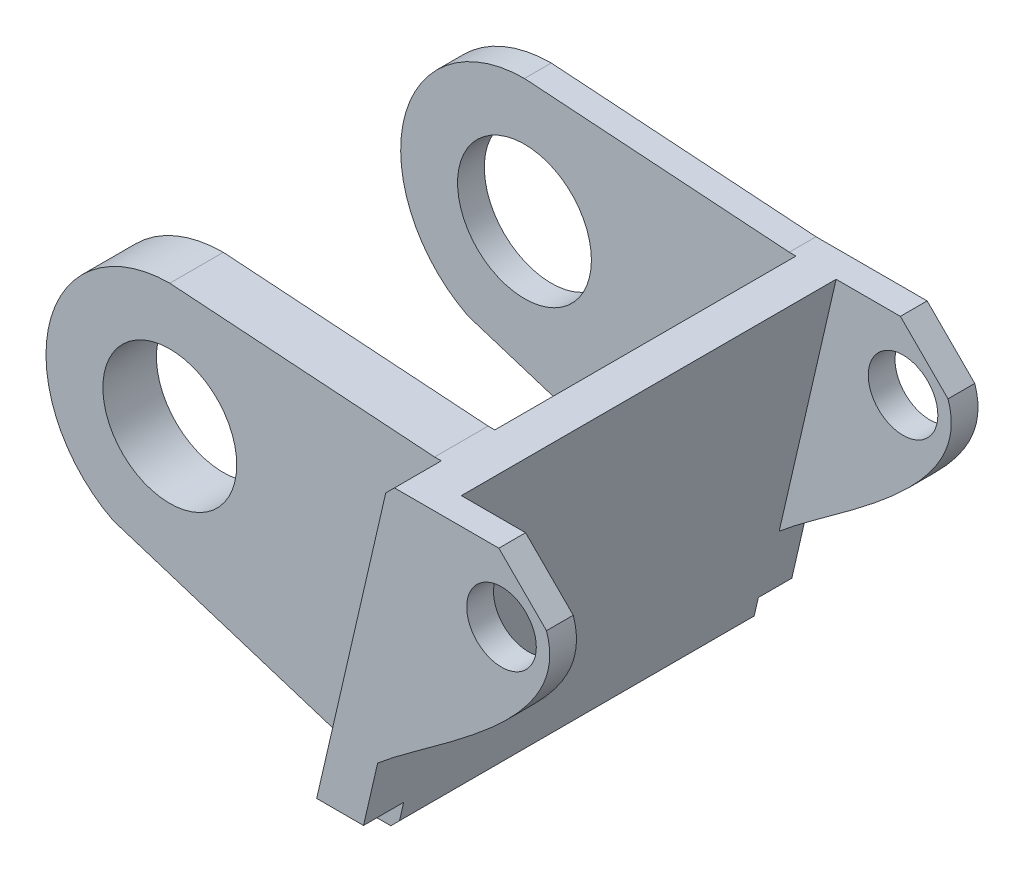
ISO-10303-21;
HEADER;
FILE_DESCRIPTION(('STEP AP214'),'2;1');
FILE_NAME('part.step','',(''),(''),'','','');
FILE_SCHEMA(('AUTOMOTIVE_DESIGN { 1 0 10303 214 1 1 1 1 }'));
ENDSEC;
DATA;
#1=APPLICATION_CONTEXT('core data for automotive mechanical design processes');
#2=APPLICATION_PROTOCOL_DEFINITION('international standard','automotive_design',2000,#1);
#3=PRODUCT_CONTEXT('',#1,'mechanical');
#4=PRODUCT('Part','Part','',(#3));
#5=PRODUCT_RELATED_PRODUCT_CATEGORY('part','',(#4));
#6=PRODUCT_DEFINITION_FORMATION('','',#4);
#7=PRODUCT_DEFINITION_CONTEXT('part definition',#1,'design');
#8=PRODUCT_DEFINITION('design','',#6,#7);
#9=PRODUCT_DEFINITION_SHAPE('','',#8);
#10=(LENGTH_UNIT() NAMED_UNIT(*) SI_UNIT(.MILLI.,.METRE.));
#11=(NAMED_UNIT(*) PLANE_ANGLE_UNIT() SI_UNIT($,.RADIAN.));
#12=(NAMED_UNIT(*) SI_UNIT($,.STERADIAN.) SOLID_ANGLE_UNIT());
#13=UNCERTAINTY_MEASURE_WITH_UNIT(LENGTH_MEASURE(1.E-05),#10,'distance_accuracy_value','');
#14=(GEOMETRIC_REPRESENTATION_CONTEXT(3) GLOBAL_UNCERTAINTY_ASSIGNED_CONTEXT((#13)) GLOBAL_UNIT_ASSIGNED_CONTEXT((#10,
#11,#12)) REPRESENTATION_CONTEXT('',''));
#15=CARTESIAN_POINT('',(0.,0.,0.));
#16=DIRECTION('',(0.,0.,1.));
#17=DIRECTION('',(1.,0.,0.));
#18=AXIS2_PLACEMENT_3D('',#15,#16,#17);
#19=CARTESIAN_POINT('',(10.1099099822132,160.217391304348,320.));
#20=DIRECTION('',(0.974370064785234,-0.224951054343869,0.));
#21=DIRECTION('',(0.224951054343869,0.974370064785234,0.));
#22=AXIS2_PLACEMENT_3D('',#19,#20,#21);
#23=PLANE('',#22);
#24=DIRECTION('',(-0.224951054343869,-0.974370064785234,0.));
#25=VECTOR('',#24,1.);
#26=CARTESIAN_POINT('',(-47.6071377991786,-89.7826086956521,25.));
#27=LINE('',#26,#25);
#28=CARTESIAN_POINT('',(-42.9897739766673,-69.7826086956521,25.));
#29=VERTEX_POINT('',#28);
#30=CARTESIAN_POINT('',(-46.4823825274593,-84.9107583717259,25.));
#31=VERTEX_POINT('',#30);
#32=EDGE_CURVE('E571',#29,#31,#27,.T.);
#33=ORIENTED_EDGE('',*,*,#32,.T.);
#34=DIRECTION('',(0.,0.,1.));
#35=VECTOR('',#34,1.);
#36=CARTESIAN_POINT('',(-46.4823825274593,-84.9107583717258,320.));
#37=LINE('',#36,#35);
#38=CARTESIAN_POINT('',(-46.4823825274593,-84.9107583717259,290.));
#39=VERTEX_POINT('',#38);
#40=EDGE_CURVE('E449',#31,#39,#37,.T.);
#41=ORIENTED_EDGE('',*,*,#40,.T.);
#42=DIRECTION('',(-0.224951054343869,-0.974370064785234,0.));
#43=VECTOR('',#42,1.);
#44=CARTESIAN_POINT('',(-47.6071377991786,-89.7826086956521,290.));
#45=LINE('',#44,#43);
#46=CARTESIAN_POINT('',(-42.9897739766673,-69.7826086956521,290.));
#47=VERTEX_POINT('',#46);
#48=EDGE_CURVE('E540',#47,#39,#45,.T.);
#49=ORIENTED_EDGE('',*,*,#48,.F.);
#50=DIRECTION('',(0.,0.,1.));
#51=VECTOR('',#50,1.);
#52=CARTESIAN_POINT('',(-42.9897739766673,-69.7826086956521,290.));
#53=LINE('',#52,#51);
#54=CARTESIAN_POINT('',(-42.9897739766673,-69.7826086956521,320.));
#55=VERTEX_POINT('',#54);
#56=EDGE_CURVE('E528',#47,#55,#53,.T.);
#57=ORIENTED_EDGE('',*,*,#56,.T.);
#58=DIRECTION('',(-0.224951054343869,-0.974370064785234,0.));
#59=VECTOR('',#58,1.);
#60=CARTESIAN_POINT('',(10.1099099822132,160.217391304348,320.));
#61=LINE('',#60,#59);
#62=CARTESIAN_POINT('',(8.60907365961056,153.716554981745,320.));
#63=VERTEX_POINT('',#62);
#64=EDGE_CURVE('E520',#63,#55,#61,.T.);
#65=ORIENTED_EDGE('',*,*,#64,.F.);
#66=DIRECTION('',(0.,0.,-1.));
#67=VECTOR('',#66,1.);
#68=CARTESIAN_POINT('',(8.60907365961056,153.716554981745,320.));
#69=LINE('',#68,#67);
#70=CARTESIAN_POINT('',(8.60907365961056,153.716554981745,285.));
#71=VERTEX_POINT('',#70);
#72=EDGE_CURVE('E504',#63,#71,#69,.T.);
#73=ORIENTED_EDGE('',*,*,#72,.T.);
#74=DIRECTION('',(-0.224951054343869,-0.974370064785234,0.));
#75=VECTOR('',#74,1.);
#76=CARTESIAN_POINT('',(-25.5190223393978,5.89153052678971,285.));
#77=LINE('',#76,#75);
#78=CARTESIAN_POINT('',(-40.98572608345,-61.1021235952716,285.));
#79=VERTEX_POINT('',#78);
#80=EDGE_CURVE('E284',#71,#79,#77,.T.);
#81=ORIENTED_EDGE('',*,*,#80,.T.);
#82=DIRECTION('',(0.,0.,1.));
#83=VECTOR('',#82,1.);
#84=CARTESIAN_POINT('',(-40.98572608345,-61.1021235952716,245.));
#85=LINE('',#84,#83);
#86=CARTESIAN_POINT('',(-40.98572608345,-61.1021235952716,245.));
#87=VERTEX_POINT('',#86);
#88=EDGE_CURVE('E317',#87,#79,#85,.T.);
#89=ORIENTED_EDGE('',*,*,#88,.F.);
#90=DIRECTION('',(-0.224951054343869,-0.974370064785234,0.));
#91=VECTOR('',#90,1.);
#92=CARTESIAN_POINT('',(-25.5190223393978,5.89153052678971,245.));
#93=LINE('',#92,#91);
#94=CARTESIAN_POINT('',(8.60907365961056,153.716554981745,245.));
#95=VERTEX_POINT('',#94);
#96=EDGE_CURVE('E295',#95,#87,#93,.T.);
#97=ORIENTED_EDGE('',*,*,#96,.F.);
#98=DIRECTION('',(0.,0.,-1.));
#99=VECTOR('',#98,1.);
#100=CARTESIAN_POINT('',(8.60907365961056,153.716554981745,320.));
#101=LINE('',#100,#99);
#102=CARTESIAN_POINT('',(8.60907365961056,153.716554981745,20.));
#103=VERTEX_POINT('',#102);
#104=EDGE_CURVE('E508',#95,#103,#101,.T.);
#105=ORIENTED_EDGE('',*,*,#104,.T.);
#106=DIRECTION('',(-0.224951054343869,-0.974370064785234,0.));
#107=VECTOR('',#106,1.);
#108=CARTESIAN_POINT('',(-25.5190223393978,5.89153052678971,20.));
#109=LINE('',#108,#107);
#110=CARTESIAN_POINT('',(-40.98572608345,-61.1021235952716,20.));
#111=VERTEX_POINT('',#110);
#112=EDGE_CURVE('E652',#103,#111,#109,.T.);
#113=ORIENTED_EDGE('',*,*,#112,.T.);
#114=DIRECTION('',(0.,0.,-1.));
#115=VECTOR('',#114,1.);
#116=CARTESIAN_POINT('',(-40.98572608345,-61.1021235952716,20.));
#117=LINE('',#116,#115);
#118=CARTESIAN_POINT('',(-40.98572608345,-61.1021235952716,0.));
#119=VERTEX_POINT('',#118);
#120=EDGE_CURVE('E275',#111,#119,#117,.T.);
#121=ORIENTED_EDGE('',*,*,#120,.T.);
#122=DIRECTION('',(-0.224951054343869,-0.974370064785234,0.));
#123=VECTOR('',#122,1.);
#124=CARTESIAN_POINT('',(10.1099099822132,160.217391304348,0.));
#125=LINE('',#124,#123);
#126=CARTESIAN_POINT('',(-42.9897739766673,-69.7826086956521,0.));
#127=VERTEX_POINT('',#126);
#128=EDGE_CURVE('E525',#119,#127,#125,.T.);
#129=ORIENTED_EDGE('',*,*,#128,.T.);
#130=DIRECTION('',(0.,0.,1.));
#131=VECTOR('',#130,1.);
#132=CARTESIAN_POINT('',(-42.9897739766673,-69.7826086956521,0.));
#133=LINE('',#132,#131);
#134=EDGE_CURVE('E549',#127,#29,#133,.T.);
#135=ORIENTED_EDGE('',*,*,#134,.T.);
#136=EDGE_LOOP('',(#33,#41,#49,#57,#65,#73,#81,#89,#97,#105,#113,#121,#129,#135));
#137=FACE_BOUND('',#136,.T.);
#138=ADVANCED_FACE('F60',(#137),#23,.F.);
#139=CARTESIAN_POINT('',(45.1099099822132,160.217391304348,320.));
#140=DIRECTION('',(-0.974370064785234,0.224951054343869,0.));
#141=DIRECTION('',(-0.224951054343869,-0.974370064785234,0.));
#142=AXIS2_PLACEMENT_3D('',#139,#140,#141);
#143=PLANE('',#142);
#144=DIRECTION('',(0.224951054343869,0.974370064785234,0.));
#145=VECTOR('',#144,1.);
#146=CARTESIAN_POINT('',(-7.98977397666728,-69.7826086956521,290.));
#147=LINE('',#146,#145);
#148=CARTESIAN_POINT('',(-11.106301476576,-83.2817723730496,290.));
#149=VERTEX_POINT('',#148);
#150=CARTESIAN_POINT('',(-7.98977397666728,-69.7826086956521,290.));
#151=VERTEX_POINT('',#150);
#152=EDGE_CURVE('E557',#149,#151,#147,.T.);
#153=ORIENTED_EDGE('',*,*,#152,.F.);
#154=DIRECTION('',(0.,0.,-1.));
#155=VECTOR('',#154,1.);
#156=CARTESIAN_POINT('',(-11.106301476576,-83.2817723730495,320.));
#157=LINE('',#156,#155);
#158=CARTESIAN_POINT('',(-11.106301476576,-83.2817723730496,25.));
#159=VERTEX_POINT('',#158);
#160=EDGE_CURVE('E471',#149,#159,#157,.T.);
#161=ORIENTED_EDGE('',*,*,#160,.T.);
#162=DIRECTION('',(0.224951054343869,0.974370064785234,0.));
#163=VECTOR('',#162,1.);
#164=CARTESIAN_POINT('',(-7.98977397666728,-69.7826086956521,25.));
#165=LINE('',#164,#163);
#166=CARTESIAN_POINT('',(-7.98977397666728,-69.7826086956521,25.));
#167=VERTEX_POINT('',#166);
#168=EDGE_CURVE('E578',#159,#167,#165,.T.);
#169=ORIENTED_EDGE('',*,*,#168,.T.);
#170=DIRECTION('',(0.,0.,1.));
#171=VECTOR('',#170,1.);
#172=CARTESIAN_POINT('',(-7.98977397666728,-69.7826086956521,0.));
#173=LINE('',#172,#171);
#174=CARTESIAN_POINT('',(-7.98977397666728,-69.7826086956521,0.));
#175=VERTEX_POINT('',#174);
#176=EDGE_CURVE('E563',#175,#167,#173,.T.);
#177=ORIENTED_EDGE('',*,*,#176,.F.);
#178=DIRECTION('',(0.224951054343869,0.974370064785234,0.));
#179=VECTOR('',#178,1.);
#180=CARTESIAN_POINT('',(45.1099099822132,160.217391304348,0.));
#181=LINE('',#180,#179);
#182=CARTESIAN_POINT('',(2.5517065549748,-24.1224400936092,0.));
#183=VERTEX_POINT('',#182);
#184=EDGE_CURVE('E521',#175,#183,#181,.T.);
#185=ORIENTED_EDGE('',*,*,#184,.T.);
#186=DIRECTION('',(0.,0.,-1.));
#187=VECTOR('',#186,1.);
#188=CARTESIAN_POINT('',(2.55170655497482,-24.1224400936092,20.));
#189=LINE('',#188,#187);
#190=CARTESIAN_POINT('',(2.55170655497482,-24.1224400936092,20.));
#191=VERTEX_POINT('',#190);
#192=EDGE_CURVE('E621',#191,#183,#189,.T.);
#193=ORIENTED_EDGE('',*,*,#192,.F.);
#194=DIRECTION('',(-0.224951054343869,-0.974370064785234,0.));
#195=VECTOR('',#194,1.);
#196=CARTESIAN_POINT('',(45.1099099822132,160.217391304348,20.));
#197=LINE('',#196,#195);
#198=CARTESIAN_POINT('',(45.1099099822132,160.217391304348,20.));
#199=VERTEX_POINT('',#198);
#200=EDGE_CURVE('E619',#199,#191,#197,.T.);
#201=ORIENTED_EDGE('',*,*,#200,.F.);
#202=DIRECTION('',(0.,0.,-1.));
#203=VECTOR('',#202,1.);
#204=CARTESIAN_POINT('',(45.1099099822132,160.217391304348,320.));
#205=LINE('',#204,#203);
#206=CARTESIAN_POINT('',(45.1099099822132,160.217391304348,300.));
#207=VERTEX_POINT('',#206);
#208=EDGE_CURVE('E512',#207,#199,#205,.T.);
#209=ORIENTED_EDGE('',*,*,#208,.F.);
#210=DIRECTION('',(0.224951054343869,0.974370064785234,0.));
#211=VECTOR('',#210,1.);
#212=CARTESIAN_POINT('',(7.70987347083757,-1.77996454201927,300.));
#213=LINE('',#212,#211);
#214=CARTESIAN_POINT('',(2.5517065549748,-24.1224400936092,300.));
#215=VERTEX_POINT('',#214);
#216=EDGE_CURVE('E605',#215,#207,#213,.T.);
#217=ORIENTED_EDGE('',*,*,#216,.F.);
#218=DIRECTION('',(0.,0.,1.));
#219=VECTOR('',#218,1.);
#220=CARTESIAN_POINT('',(2.5517065549748,-24.1224400936092,300.));
#221=LINE('',#220,#219);
#222=CARTESIAN_POINT('',(2.5517065549748,-24.1224400936092,320.));
#223=VERTEX_POINT('',#222);
#224=EDGE_CURVE('E585',#215,#223,#221,.T.);
#225=ORIENTED_EDGE('',*,*,#224,.T.);
#226=DIRECTION('',(0.224951054343869,0.974370064785234,0.));
#227=VECTOR('',#226,1.);
#228=CARTESIAN_POINT('',(45.1099099822132,160.217391304348,320.));
#229=LINE('',#228,#227);
#230=CARTESIAN_POINT('',(-7.98977397666729,-69.7826086956522,320.));
#231=VERTEX_POINT('',#230);
#232=EDGE_CURVE('E531',#231,#223,#229,.T.);
#233=ORIENTED_EDGE('',*,*,#232,.F.);
#234=DIRECTION('',(0.,0.,1.));
#235=VECTOR('',#234,1.);
#236=CARTESIAN_POINT('',(-7.98977397666728,-69.7826086956521,290.));
#237=LINE('',#236,#235);
#238=EDGE_CURVE('E537',#151,#231,#237,.T.);
#239=ORIENTED_EDGE('',*,*,#238,.F.);
#240=EDGE_LOOP('',(#153,#161,#169,#177,#185,#193,#201,#209,#217,#225,#233,#239));
#241=FACE_BOUND('',#240,.T.);
#242=ADVANCED_FACE('F374',(#241),#143,.F.);
#243=CARTESIAN_POINT('',(-47.6071377991786,-89.7826086956521,320.));
#244=DIRECTION('',(0.,1.,0.));
#245=DIRECTION('',(0.,0.,1.));
#246=AXIS2_PLACEMENT_3D('',#243,#244,#245);
#247=PLANE('',#246);
#248=DIRECTION('',(1.,0.,0.));
#249=VECTOR('',#248,1.);
#250=CARTESIAN_POINT('',(-12.6071377991786,-89.7826086956521,25.));
#251=LINE('',#250,#249);
#252=CARTESIAN_POINT('',(-43.4381125729482,-89.7826086956521,25.));
#253=VERTEX_POINT('',#252);
#254=CARTESIAN_POINT('',(-17.6071377991786,-89.7826086956521,25.));
#255=VERTEX_POINT('',#254);
#256=EDGE_CURVE('E581',#253,#255,#251,.T.);
#257=ORIENTED_EDGE('',*,*,#256,.T.);
#258=DIRECTION('',(0.,0.,1.));
#259=VECTOR('',#258,1.);
#260=CARTESIAN_POINT('',(-17.6071377991786,-89.7826086956521,320.));
#261=LINE('',#260,#259);
#262=CARTESIAN_POINT('',(-17.6071377991786,-89.7826086956521,290.));
#263=VERTEX_POINT('',#262);
#264=EDGE_CURVE('E458',#255,#263,#261,.T.);
#265=ORIENTED_EDGE('',*,*,#264,.T.);
#266=DIRECTION('',(1.,0.,0.));
#267=VECTOR('',#266,1.);
#268=CARTESIAN_POINT('',(-12.6071377991786,-89.7826086956521,290.));
#269=LINE('',#268,#267);
#270=CARTESIAN_POINT('',(-43.4381125729482,-89.7826086956521,290.));
#271=VERTEX_POINT('',#270);
#272=EDGE_CURVE('E548',#271,#263,#269,.T.);
#273=ORIENTED_EDGE('',*,*,#272,.F.);
#274=DIRECTION('',(0.,0.,-1.));
#275=VECTOR('',#274,1.);
#276=CARTESIAN_POINT('',(-43.4381125729482,-89.7826086956521,320.));
#277=LINE('',#276,#275);
#278=EDGE_CURVE('E461',#271,#253,#277,.T.);
#279=ORIENTED_EDGE('',*,*,#278,.T.);
#280=EDGE_LOOP('',(#257,#265,#273,#279));
#281=FACE_BOUND('',#280,.T.);
#282=ADVANCED_FACE('F372',(#281),#247,.F.);
#283=CARTESIAN_POINT('',(10.1099099822132,160.217391304348,320.));
#284=DIRECTION('',(0.,-1.,0.));
#285=DIRECTION('',(1.,0.,0.));
#286=AXIS2_PLACEMENT_3D('',#283,#284,#285);
#287=PLANE('',#286);
#288=DIRECTION('',(1.,0.,0.));
#289=VECTOR('',#288,1.);
#290=CARTESIAN_POINT('',(45.1099099822132,160.217391304348,20.));
#291=LINE('',#290,#289);
#292=CARTESIAN_POINT('',(93.1099099822131,160.217391304348,20.));
#293=VERTEX_POINT('',#292);
#294=EDGE_CURVE('E630',#199,#293,#291,.T.);
#295=ORIENTED_EDGE('',*,*,#294,.T.);
#296=DIRECTION('',(0.,0.,-1.));
#297=VECTOR('',#296,1.);
#298=CARTESIAN_POINT('',(93.1099099822131,160.217391304348,0.));
#299=LINE('',#298,#297);
#300=CARTESIAN_POINT('',(93.1099099822131,160.217391304348,0.));
#301=VERTEX_POINT('',#300);
#302=EDGE_CURVE('E433',#293,#301,#299,.T.);
#303=ORIENTED_EDGE('',*,*,#302,.T.);
#304=DIRECTION('',(-1.,0.,0.));
#305=VECTOR('',#304,1.);
#306=CARTESIAN_POINT('',(10.1099099822132,160.217391304348,0.));
#307=LINE('',#306,#305);
#308=CARTESIAN_POINT('',(10.1099099822132,160.217391304348,0.));
#309=VERTEX_POINT('',#308);
#310=EDGE_CURVE('E517',#301,#309,#307,.T.);
#311=ORIENTED_EDGE('',*,*,#310,.T.);
#312=DIRECTION('',(0.,0.,-1.));
#313=VECTOR('',#312,1.);
#314=CARTESIAN_POINT('',(10.1099099822132,160.217391304348,20.));
#315=LINE('',#314,#313);
#316=CARTESIAN_POINT('',(10.1099099822132,160.217391304348,20.));
#317=VERTEX_POINT('',#316);
#318=EDGE_CURVE('E655',#317,#309,#315,.T.);
#319=ORIENTED_EDGE('',*,*,#318,.F.);
#320=DIRECTION('',(1.,0.,0.));
#321=VECTOR('',#320,1.);
#322=CARTESIAN_POINT('',(-1.27055026265332E-13,160.217391304348,20.));
#323=LINE('',#322,#321);
#324=CARTESIAN_POINT('',(15.1099099822132,160.217391304348,20.));
#325=VERTEX_POINT('',#324);
#326=EDGE_CURVE('E257',#317,#325,#323,.T.);
#327=ORIENTED_EDGE('',*,*,#326,.T.);
#328=DIRECTION('',(0.,0.,1.));
#329=VECTOR('',#328,1.);
#330=CARTESIAN_POINT('',(15.1099099822132,160.217391304348,320.));
#331=LINE('',#330,#329);
#332=CARTESIAN_POINT('',(15.1099099822132,160.217391304348,245.));
#333=VERTEX_POINT('',#332);
#334=EDGE_CURVE('E497',#325,#333,#331,.T.);
#335=ORIENTED_EDGE('',*,*,#334,.T.);
#336=DIRECTION('',(-1.,0.,0.));
#337=VECTOR('',#336,1.);
#338=CARTESIAN_POINT('',(10.1099099822132,160.217391304348,245.));
#339=LINE('',#338,#337);
#340=CARTESIAN_POINT('',(10.1099099822132,160.217391304348,245.));
#341=VERTEX_POINT('',#340);
#342=EDGE_CURVE('E501',#333,#341,#339,.T.);
#343=ORIENTED_EDGE('',*,*,#342,.T.);
#344=DIRECTION('',(0.,0.,1.));
#345=VECTOR('',#344,1.);
#346=CARTESIAN_POINT('',(10.1099099822132,160.217391304348,245.));
#347=LINE('',#346,#345);
#348=CARTESIAN_POINT('',(10.1099099822132,160.217391304348,285.));
#349=VERTEX_POINT('',#348);
#350=EDGE_CURVE('E312',#341,#349,#347,.T.);
#351=ORIENTED_EDGE('',*,*,#350,.T.);
#352=DIRECTION('',(1.,0.,0.));
#353=VECTOR('',#352,1.);
#354=CARTESIAN_POINT('',(-1.27055026265332E-13,160.217391304348,285.));
#355=LINE('',#354,#353);
#356=CARTESIAN_POINT('',(15.1099099822132,160.217391304348,285.));
#357=VERTEX_POINT('',#356);
#358=EDGE_CURVE('E487',#349,#357,#355,.T.);
#359=ORIENTED_EDGE('',*,*,#358,.T.);
#360=DIRECTION('',(0.,0.,1.));
#361=VECTOR('',#360,1.);
#362=CARTESIAN_POINT('',(15.1099099822132,160.217391304348,320.));
#363=LINE('',#362,#361);
#364=CARTESIAN_POINT('',(15.1099099822132,160.217391304348,320.));
#365=VERTEX_POINT('',#364);
#366=EDGE_CURVE('E491',#357,#365,#363,.T.);
#367=ORIENTED_EDGE('',*,*,#366,.T.);
#368=DIRECTION('',(-1.,0.,0.));
#369=VECTOR('',#368,1.);
#370=CARTESIAN_POINT('',(10.1099099822132,160.217391304348,320.));
#371=LINE('',#370,#369);
#372=CARTESIAN_POINT('',(93.1099099822131,160.217391304348,320.));
#373=VERTEX_POINT('',#372);
#374=EDGE_CURVE('E516',#373,#365,#371,.T.);
#375=ORIENTED_EDGE('',*,*,#374,.F.);
#376=DIRECTION('',(0.,0.,-1.));
#377=VECTOR('',#376,1.);
#378=CARTESIAN_POINT('',(93.1099099822131,160.217391304348,320.));
#379=LINE('',#378,#377);
#380=CARTESIAN_POINT('',(93.1099099822131,160.217391304348,300.));
#381=VERTEX_POINT('',#380);
#382=EDGE_CURVE('E426',#373,#381,#379,.T.);
#383=ORIENTED_EDGE('',*,*,#382,.T.);
#384=DIRECTION('',(1.,0.,0.));
#385=VECTOR('',#384,1.);
#386=CARTESIAN_POINT('',(0.,160.217391304348,300.));
#387=LINE('',#386,#385);
#388=EDGE_CURVE('E332',#207,#381,#387,.T.);
#389=ORIENTED_EDGE('',*,*,#388,.F.);
#390=ORIENTED_EDGE('',*,*,#208,.T.);
#391=EDGE_LOOP('',(#295,#303,#311,#319,#327,#335,#343,#351,#359,#367,#375,#383,#389,#390));
#392=FACE_BOUND('',#391,.T.);
#393=ADVANCED_FACE('F366',(#392),#287,.F.);
#394=CARTESIAN_POINT('',(0.,0.,320.));
#395=DIRECTION('',(0.,0.,1.));
#396=DIRECTION('',(1.,0.,0.));
#397=AXIS2_PLACEMENT_3D('',#394,#395,#396);
#398=PLANE('',#397);
#399=CARTESIAN_POINT('',(98.1099099822132,160.217391304348,320.));
#400=CARTESIAN_POINT('',(195.681111268055,92.3774065899261,320.));
#401=CARTESIAN_POINT('',(50.5144604771551,17.4979795418495,320.));
#402=CARTESIAN_POINT('',(2.55170655497482,-24.1224400936092,320.));
#403=B_SPLINE_CURVE_WITH_KNOTS('',3,(#399,#400,#401,#402),.UNSPECIFIED.,.F.,.F.,(4,4),(0.,1.),.UNSPECIFIED.);
#404=CARTESIAN_POINT('',(128.70034107304,124.626960213553,320.));
#405=VERTEX_POINT('',#404);
#406=EDGE_CURVE('E316',#405,#223,#403,.T.);
#407=ORIENTED_EDGE('',*,*,#406,.F.);
#408=DIRECTION('',(0.707106781186863,-0.707106781186232,0.));
#409=VECTOR('',#408,1.);
#410=CARTESIAN_POINT('',(126.663650643239,126.663650643352,320.));
#411=LINE('',#410,#409);
#412=EDGE_CURVE('E439',#405,#373,#411,.F.);
#413=ORIENTED_EDGE('',*,*,#412,.T.);
#414=ORIENTED_EDGE('',*,*,#374,.T.);
#415=DIRECTION('',(0.707106781186548,0.707106781186547,0.));
#416=VECTOR('',#415,1.);
#417=CARTESIAN_POINT('',(-72.5537406610674,72.5537406610674,320.));
#418=LINE('',#417,#416);
#419=EDGE_CURVE('E484',#365,#63,#418,.F.);
#420=ORIENTED_EDGE('',*,*,#419,.T.);
#421=ORIENTED_EDGE('',*,*,#64,.T.);
#422=DIRECTION('',(-1.,0.,0.));
#423=VECTOR('',#422,1.);
#424=CARTESIAN_POINT('',(-42.9897739766673,-69.7826086956521,320.));
#425=LINE('',#424,#423);
#426=EDGE_CURVE('E544',#231,#55,#425,.T.);
#427=ORIENTED_EDGE('',*,*,#426,.F.);
#428=ORIENTED_EDGE('',*,*,#232,.T.);
#429=EDGE_LOOP('',(#407,#413,#414,#420,#421,#427,#428));
#430=FACE_BOUND('',#429,.T.);
#431=CARTESIAN_POINT('',(95.1099099822132,110.217391304348,320.));
#432=DIRECTION('',(0.,0.,1.));
#433=DIRECTION('',(1.,0.,0.));
#434=AXIS2_PLACEMENT_3D('',#431,#432,#433);
#435=CIRCLE('',#434,26.);
#436=CARTESIAN_POINT('',(121.109909982213,110.217391304348,320.));
#437=VERTEX_POINT('',#436);
#438=EDGE_CURVE('E333',#437,#437,#435,.T.);
#439=ORIENTED_EDGE('',*,*,#438,.F.);
#440=EDGE_LOOP('',(#439));
#441=FACE_BOUND('',#440,.T.);
#442=ADVANCED_FACE('F363',(#430,#441),#398,.T.);
#443=CARTESIAN_POINT('',(0.,0.,0.));
#444=DIRECTION('',(0.,0.,1.));
#445=DIRECTION('',(1.,0.,0.));
#446=AXIS2_PLACEMENT_3D('',#443,#444,#445);
#447=PLANE('',#446);
#448=ORIENTED_EDGE('',*,*,#310,.F.);
#449=DIRECTION('',(-0.707106781186863,0.707106781186232,0.));
#450=VECTOR('',#449,1.);
#451=CARTESIAN_POINT('',(93.1099099822131,160.217391304348,0.));
#452=LINE('',#451,#450);
#453=CARTESIAN_POINT('',(128.70034107304,124.626960213553,0.));
#454=VERTEX_POINT('',#453);
#455=EDGE_CURVE('E84',#301,#454,#452,.F.);
#456=ORIENTED_EDGE('',*,*,#455,.T.);
#457=CARTESIAN_POINT('',(98.1099099822132,160.217391304348,0.));
#458=CARTESIAN_POINT('',(195.681111268055,92.3774065899261,0.));
#459=CARTESIAN_POINT('',(50.5144604771551,17.4979795418495,0.));
#460=CARTESIAN_POINT('',(2.55170655497482,-24.1224400936092,0.));
#461=B_SPLINE_CURVE_WITH_KNOTS('',3,(#457,#458,#459,#460),.UNSPECIFIED.,.F.,.F.,(4,4),(0.,1.),.UNSPECIFIED.);
#462=EDGE_CURVE('E637',#454,#183,#461,.T.);
#463=ORIENTED_EDGE('',*,*,#462,.T.);
#464=ORIENTED_EDGE('',*,*,#184,.F.);
#465=DIRECTION('',(-1.,0.,0.));
#466=VECTOR('',#465,1.);
#467=CARTESIAN_POINT('',(-42.9897739766673,-69.7826086956521,0.));
#468=LINE('',#467,#466);
#469=EDGE_CURVE('E567',#175,#127,#468,.T.);
#470=ORIENTED_EDGE('',*,*,#469,.T.);
#471=ORIENTED_EDGE('',*,*,#128,.F.);
#472=DIRECTION('',(-0.953008870057957,0.302942393188632,0.));
#473=VECTOR('',#472,1.);
#474=CARTESIAN_POINT('',(-21.4020256939702,-67.3273889100817,0.));
#475=LINE('',#474,#473);
#476=CARTESIAN_POINT('',(-230.213971145214,-0.950262244380495,0.));
#477=VERTEX_POINT('',#476);
#478=EDGE_CURVE('E648',#119,#477,#475,.T.);
#479=ORIENTED_EDGE('',*,*,#478,.T.);
#480=CARTESIAN_POINT('',(-187.73189598055,81.2173913043479,0.));
#481=DIRECTION('',(0.,0.,1.));
#482=DIRECTION('',(1.,0.,0.));
#483=AXIS2_PLACEMENT_3D('',#480,#481,#482);
#484=CIRCLE('',#483,92.5);
#485=CARTESIAN_POINT('',(-187.73189598055,173.717391304348,0.));
#486=VERTEX_POINT('',#485);
#487=EDGE_CURVE('E661',#486,#477,#484,.T.);
#488=ORIENTED_EDGE('',*,*,#487,.F.);
#489=DIRECTION('',(-0.997679999854186,0.0680780279602103,0.));
#490=VECTOR('',#489,1.);
#491=CARTESIAN_POINT('',(10.9288347140342,160.161510880967,0.));
#492=LINE('',#491,#490);
#493=EDGE_CURVE('E266',#309,#486,#492,.T.);
#494=ORIENTED_EDGE('',*,*,#493,.F.);
#495=EDGE_LOOP('',(#448,#456,#463,#464,#470,#471,#479,#488,#494));
#496=FACE_BOUND('',#495,.T.);
#497=CARTESIAN_POINT('',(-187.73189598055,81.2173913043479,0.));
#498=DIRECTION('',(0.,0.,1.));
#499=DIRECTION('',(1.,0.,0.));
#500=AXIS2_PLACEMENT_3D('',#497,#498,#499);
#501=CIRCLE('',#500,50.);
#502=CARTESIAN_POINT('',(-137.73189598055,81.2173913043479,0.));
#503=VERTEX_POINT('',#502);
#504=EDGE_CURVE('E628',#503,#503,#501,.T.);
#505=ORIENTED_EDGE('',*,*,#504,.T.);
#506=EDGE_LOOP('',(#505));
#507=FACE_BOUND('',#506,.T.);
#508=CARTESIAN_POINT('',(95.1099099822132,110.217391304348,0.));
#509=DIRECTION('',(0.,0.,1.));
#510=DIRECTION('',(1.,0.,0.));
#511=AXIS2_PLACEMENT_3D('',#508,#509,#510);
#512=CIRCLE('',#511,26.);
#513=CARTESIAN_POINT('',(121.109909982213,110.217391304348,0.));
#514=VERTEX_POINT('',#513);
#515=EDGE_CURVE('E992',#514,#514,#512,.T.);
#516=ORIENTED_EDGE('',*,*,#515,.T.);
#517=EDGE_LOOP('',(#516));
#518=FACE_BOUND('',#517,.T.);
#519=ADVANCED_FACE('F361',(#496,#507,#518),#447,.F.);
#520=CARTESIAN_POINT('',(-42.9897739766673,-69.7826086956521,290.));
#521=DIRECTION('',(0.,1.,0.));
#522=DIRECTION('',(0.,0.,1.));
#523=AXIS2_PLACEMENT_3D('',#520,#521,#522);
#524=PLANE('',#523);
#525=ORIENTED_EDGE('',*,*,#426,.T.);
#526=ORIENTED_EDGE('',*,*,#56,.F.);
#527=DIRECTION('',(-1.,0.,0.));
#528=VECTOR('',#527,1.);
#529=CARTESIAN_POINT('',(-42.9897739766673,-69.7826086956521,290.));
#530=LINE('',#529,#528);
#531=EDGE_CURVE('E553',#151,#47,#530,.T.);
#532=ORIENTED_EDGE('',*,*,#531,.F.);
#533=ORIENTED_EDGE('',*,*,#238,.T.);
#534=EDGE_LOOP('',(#525,#526,#532,#533));
#535=FACE_BOUND('',#534,.T.);
#536=ADVANCED_FACE('F357',(#535),#524,.F.);
#537=CARTESIAN_POINT('',(0.,0.,290.));
#538=DIRECTION('',(0.,0.,-1.));
#539=DIRECTION('',(-1.,0.,0.));
#540=AXIS2_PLACEMENT_3D('',#537,#538,#539);
#541=PLANE('',#540);
#542=ORIENTED_EDGE('',*,*,#272,.T.);
#543=DIRECTION('',(-0.707106781186552,-0.707106781186543,0.));
#544=VECTOR('',#543,1.);
#545=CARTESIAN_POINT('',(-11.106301476576,-83.2817723730496,290.));
#546=LINE('',#545,#544);
#547=EDGE_CURVE('E452',#263,#149,#546,.F.);
#548=ORIENTED_EDGE('',*,*,#547,.T.);
#549=ORIENTED_EDGE('',*,*,#152,.T.);
#550=ORIENTED_EDGE('',*,*,#531,.T.);
#551=ORIENTED_EDGE('',*,*,#48,.T.);
#552=DIRECTION('',(-0.529919264233211,0.848048096156422,0.));
#553=VECTOR('',#552,1.);
#554=CARTESIAN_POINT('',(-43.4381125729482,-89.7826086956521,290.));
#555=LINE('',#554,#553);
#556=EDGE_CURVE('E455',#39,#271,#555,.F.);
#557=ORIENTED_EDGE('',*,*,#556,.T.);
#558=EDGE_LOOP('',(#542,#548,#549,#550,#551,#557));
#559=FACE_BOUND('',#558,.T.);
#560=ADVANCED_FACE('F353',(#559),#541,.F.);
#561=CARTESIAN_POINT('',(-42.9897739766673,-69.7826086956521,0.));
#562=DIRECTION('',(0.,1.,0.));
#563=DIRECTION('',(0.,0.,1.));
#564=AXIS2_PLACEMENT_3D('',#561,#562,#563);
#565=PLANE('',#564);
#566=DIRECTION('',(-1.,0.,0.));
#567=VECTOR('',#566,1.);
#568=CARTESIAN_POINT('',(-42.9897739766673,-69.7826086956521,25.));
#569=LINE('',#568,#567);
#570=EDGE_CURVE('E575',#167,#29,#569,.T.);
#571=ORIENTED_EDGE('',*,*,#570,.T.);
#572=ORIENTED_EDGE('',*,*,#134,.F.);
#573=ORIENTED_EDGE('',*,*,#469,.F.);
#574=ORIENTED_EDGE('',*,*,#176,.T.);
#575=EDGE_LOOP('',(#571,#572,#573,#574));
#576=FACE_BOUND('',#575,.T.);
#577=ADVANCED_FACE('F349',(#576),#565,.F.);
#578=CARTESIAN_POINT('',(0.,0.,24.9999999999999));
#579=DIRECTION('',(0.,0.,-1.));
#580=DIRECTION('',(-1.,0.,0.));
#581=AXIS2_PLACEMENT_3D('',#578,#579,#580);
#582=PLANE('',#581);
#583=ORIENTED_EDGE('',*,*,#168,.F.);
#584=DIRECTION('',(0.707106781186552,0.707106781186543,0.));
#585=VECTOR('',#584,1.);
#586=CARTESIAN_POINT('',(36.0877354482369,-36.0877354482374,24.9999999999999));
#587=LINE('',#586,#585);
#588=EDGE_CURVE('E465',#159,#255,#587,.F.);
#589=ORIENTED_EDGE('',*,*,#588,.T.);
#590=ORIENTED_EDGE('',*,*,#256,.F.);
#591=DIRECTION('',(0.529919264233211,-0.848048096156422,0.));
#592=VECTOR('',#591,1.);
#593=CARTESIAN_POINT('',(-71.5881009763822,-44.7332102615321,24.9999999999999));
#594=LINE('',#593,#592);
#595=EDGE_CURVE('E468',#253,#31,#594,.F.);
#596=ORIENTED_EDGE('',*,*,#595,.T.);
#597=ORIENTED_EDGE('',*,*,#32,.F.);
#598=ORIENTED_EDGE('',*,*,#570,.F.);
#599=EDGE_LOOP('',(#583,#589,#590,#596,#597,#598));
#600=FACE_BOUND('',#599,.T.);
#601=ADVANCED_FACE('F344',(#600),#582,.T.);
#602=CARTESIAN_POINT('',(98.1099099822132,160.217391304348,300.));
#603=CARTESIAN_POINT('',(195.681111268055,92.3774065899261,300.));
#604=CARTESIAN_POINT('',(50.5144604771551,17.4979795418495,300.));
#605=CARTESIAN_POINT('',(2.55170655497482,-24.1224400936092,300.));
#606=B_SPLINE_CURVE_WITH_KNOTS('',3,(#602,#603,#604,#605),.UNSPECIFIED.,.F.,.F.,(4,4),(0.,1.),.UNSPECIFIED.);
#607=DIRECTION('',(0.,0.,1.));
#608=VECTOR('',#607,1.);
#609=SURFACE_OF_LINEAR_EXTRUSION('',#606,#608);
#610=CARTESIAN_POINT('',(128.70034107304,124.626960213553,300.));
#611=VERTEX_POINT('',#610);
#612=EDGE_CURVE('E326',#611,#215,#606,.T.);
#613=ORIENTED_EDGE('',*,*,#612,.F.);
#614=DIRECTION('',(0.,0.,1.));
#615=VECTOR('',#614,1.);
#616=CARTESIAN_POINT('',(128.70034107304,124.626960213553,300.));
#617=LINE('',#616,#615);
#618=EDGE_CURVE('E428',#611,#405,#617,.T.);
#619=ORIENTED_EDGE('',*,*,#618,.T.);
#620=ORIENTED_EDGE('',*,*,#406,.T.);
#621=ORIENTED_EDGE('',*,*,#224,.F.);
#622=EDGE_LOOP('',(#613,#619,#620,#621));
#623=FACE_BOUND('',#622,.T.);
#624=ADVANCED_FACE('F339',(#623),#609,.F.);
#625=CARTESIAN_POINT('',(95.1099099822132,110.217391304348,300.));
#626=DIRECTION('',(0.,0.,1.));
#627=DIRECTION('',(1.,0.,0.));
#628=AXIS2_PLACEMENT_3D('',#625,#626,#627);
#629=CYLINDRICAL_SURFACE('',#628,26.);
#630=CARTESIAN_POINT('',(95.1099099822132,110.217391304348,300.));
#631=DIRECTION('',(0.,0.,1.));
#632=DIRECTION('',(1.,0.,0.));
#633=AXIS2_PLACEMENT_3D('',#630,#631,#632);
#634=CIRCLE('',#633,26.);
#635=CARTESIAN_POINT('',(121.109909982213,110.217391304348,300.));
#636=VERTEX_POINT('',#635);
#637=EDGE_CURVE('E592',#636,#636,#634,.T.);
#638=ORIENTED_EDGE('',*,*,#637,.F.);
#639=EDGE_LOOP('',(#638));
#640=FACE_BOUND('',#639,.T.);
#641=ORIENTED_EDGE('',*,*,#438,.T.);
#642=EDGE_LOOP('',(#641));
#643=FACE_BOUND('',#642,.T.);
#644=ADVANCED_FACE('F343',(#640,#643),#629,.F.);
#645=CARTESIAN_POINT('',(0.,0.,300.));
#646=DIRECTION('',(0.,0.,1.));
#647=DIRECTION('',(1.,0.,0.));
#648=AXIS2_PLACEMENT_3D('',#645,#646,#647);
#649=PLANE('',#648);
#650=ORIENTED_EDGE('',*,*,#388,.T.);
#651=DIRECTION('',(-0.707106781186863,0.707106781186232,0.));
#652=VECTOR('',#651,1.);
#653=CARTESIAN_POINT('',(128.70034107304,124.626960213552,300.));
#654=LINE('',#653,#652);
#655=EDGE_CURVE('E425',#381,#611,#654,.F.);
#656=ORIENTED_EDGE('',*,*,#655,.T.);
#657=ORIENTED_EDGE('',*,*,#612,.T.);
#658=ORIENTED_EDGE('',*,*,#216,.T.);
#659=EDGE_LOOP('',(#650,#656,#657,#658));
#660=FACE_BOUND('',#659,.T.);
#661=ORIENTED_EDGE('',*,*,#637,.T.);
#662=EDGE_LOOP('',(#661));
#663=FACE_BOUND('',#662,.T.);
#664=ADVANCED_FACE('F610',(#660,#663),#649,.F.);
#665=CARTESIAN_POINT('',(10.9288347140342,160.161510880967,245.));
#666=DIRECTION('',(0.0680780279602103,0.997679999854186,0.));
#667=DIRECTION('',(-0.997679999854186,0.0680780279602103,0.));
#668=AXIS2_PLACEMENT_3D('',#665,#666,#667);
#669=PLANE('',#668);
#670=DIRECTION('',(-0.997679999854186,0.0680780279602103,0.));
#671=VECTOR('',#670,1.);
#672=CARTESIAN_POINT('',(10.9288347140342,160.161510880967,285.));
#673=LINE('',#672,#671);
#674=CARTESIAN_POINT('',(-187.73189598055,173.717391304348,285.));
#675=VERTEX_POINT('',#674);
#676=EDGE_CURVE('E273',#349,#675,#673,.T.);
#677=ORIENTED_EDGE('',*,*,#676,.F.);
#678=ORIENTED_EDGE('',*,*,#350,.F.);
#679=DIRECTION('',(-0.997679999854186,0.0680780279602103,0.));
#680=VECTOR('',#679,1.);
#681=CARTESIAN_POINT('',(10.9288347140342,160.161510880967,245.));
#682=LINE('',#681,#680);
#683=CARTESIAN_POINT('',(-187.73189598055,173.717391304348,245.));
#684=VERTEX_POINT('',#683);
#685=EDGE_CURVE('E283',#341,#684,#682,.T.);
#686=ORIENTED_EDGE('',*,*,#685,.T.);
#687=DIRECTION('',(0.,0.,1.));
#688=VECTOR('',#687,1.);
#689=CARTESIAN_POINT('',(-187.73189598055,173.717391304348,245.));
#690=LINE('',#689,#688);
#691=EDGE_CURVE('E297',#684,#675,#690,.T.);
#692=ORIENTED_EDGE('',*,*,#691,.T.);
#693=EDGE_LOOP('',(#677,#678,#686,#692));
#694=FACE_BOUND('',#693,.T.);
#695=ADVANCED_FACE('F709',(#694),#669,.T.);
#696=CARTESIAN_POINT('',(-21.4020256939702,-67.3273889100817,245.));
#697=DIRECTION('',(0.302942393188632,0.953008870057957,0.));
#698=DIRECTION('',(-0.953008870057957,0.302942393188632,0.));
#699=AXIS2_PLACEMENT_3D('',#696,#697,#698);
#700=PLANE('',#699);
#701=DIRECTION('',(-0.953008870057957,0.302942393188632,0.));
#702=VECTOR('',#701,1.);
#703=CARTESIAN_POINT('',(-21.4020256939702,-67.3273889100817,285.));
#704=LINE('',#703,#702);
#705=CARTESIAN_POINT('',(-230.213971145214,-0.950262244380495,285.));
#706=VERTEX_POINT('',#705);
#707=EDGE_CURVE('E306',#79,#706,#704,.T.);
#708=ORIENTED_EDGE('',*,*,#707,.T.);
#709=DIRECTION('',(0.,0.,1.));
#710=VECTOR('',#709,1.);
#711=CARTESIAN_POINT('',(-230.213971145214,-0.950262244380495,245.));
#712=LINE('',#711,#710);
#713=CARTESIAN_POINT('',(-230.213971145214,-0.950262244380495,245.));
#714=VERTEX_POINT('',#713);
#715=EDGE_CURVE('E321',#714,#706,#712,.T.);
#716=ORIENTED_EDGE('',*,*,#715,.F.);
#717=DIRECTION('',(-0.953008870057957,0.302942393188632,0.));
#718=VECTOR('',#717,1.);
#719=CARTESIAN_POINT('',(-21.4020256939702,-67.3273889100817,245.));
#720=LINE('',#719,#718);
#721=EDGE_CURVE('E292',#87,#714,#720,.T.);
#722=ORIENTED_EDGE('',*,*,#721,.F.);
#723=ORIENTED_EDGE('',*,*,#88,.T.);
#724=EDGE_LOOP('',(#708,#716,#722,#723));
#725=FACE_BOUND('',#724,.T.);
#726=ADVANCED_FACE('F717',(#725),#700,.F.);
#727=CARTESIAN_POINT('',(-187.73189598055,81.2173913043479,245.));
#728=DIRECTION('',(0.,0.,1.));
#729=DIRECTION('',(1.,0.,0.));
#730=AXIS2_PLACEMENT_3D('',#727,#728,#729);
#731=CYLINDRICAL_SURFACE('',#730,50.);
#732=CARTESIAN_POINT('',(-187.73189598055,81.2173913043479,245.));
#733=DIRECTION('',(0.,0.,1.));
#734=DIRECTION('',(1.,0.,0.));
#735=AXIS2_PLACEMENT_3D('',#732,#733,#734);
#736=CIRCLE('',#735,50.);
#737=CARTESIAN_POINT('',(-137.73189598055,81.2173913043479,245.));
#738=VERTEX_POINT('',#737);
#739=EDGE_CURVE('E279',#738,#738,#736,.T.);
#740=ORIENTED_EDGE('',*,*,#739,.F.);
#741=EDGE_LOOP('',(#740));
#742=FACE_BOUND('',#741,.T.);
#743=CARTESIAN_POINT('',(-187.73189598055,81.2173913043479,285.));
#744=DIRECTION('',(0.,0.,1.));
#745=DIRECTION('',(1.,0.,0.));
#746=AXIS2_PLACEMENT_3D('',#743,#744,#745);
#747=CIRCLE('',#746,50.);
#748=CARTESIAN_POINT('',(-137.73189598055,81.2173913043479,285.));
#749=VERTEX_POINT('',#748);
#750=EDGE_CURVE('E268',#749,#749,#747,.T.);
#751=ORIENTED_EDGE('',*,*,#750,.T.);
#752=EDGE_LOOP('',(#751));
#753=FACE_BOUND('',#752,.T.);
#754=ADVANCED_FACE('F761',(#742,#753),#731,.F.);
#755=CARTESIAN_POINT('',(-187.73189598055,81.2173913043479,245.));
#756=DIRECTION('',(0.,0.,1.));
#757=DIRECTION('',(1.,0.,0.));
#758=AXIS2_PLACEMENT_3D('',#755,#756,#757);
#759=CYLINDRICAL_SURFACE('',#758,92.5);
#760=CARTESIAN_POINT('',(-187.73189598055,81.2173913043479,285.));
#761=DIRECTION('',(0.,0.,1.));
#762=DIRECTION('',(1.,0.,0.));
#763=AXIS2_PLACEMENT_3D('',#760,#761,#762);
#764=CIRCLE('',#763,92.5);
#765=EDGE_CURVE('E302',#675,#706,#764,.T.);
#766=ORIENTED_EDGE('',*,*,#765,.F.);
#767=ORIENTED_EDGE('',*,*,#691,.F.);
#768=CARTESIAN_POINT('',(-187.73189598055,81.2173913043479,245.));
#769=DIRECTION('',(0.,0.,1.));
#770=DIRECTION('',(1.,0.,0.));
#771=AXIS2_PLACEMENT_3D('',#768,#769,#770);
#772=CIRCLE('',#771,92.5);
#773=EDGE_CURVE('E288',#684,#714,#772,.T.);
#774=ORIENTED_EDGE('',*,*,#773,.T.);
#775=ORIENTED_EDGE('',*,*,#715,.T.);
#776=EDGE_LOOP('',(#766,#767,#774,#775));
#777=FACE_BOUND('',#776,.T.);
#778=ADVANCED_FACE('F712',(#777),#759,.T.);
#779=CARTESIAN_POINT('',(0.,0.,245.));
#780=DIRECTION('',(0.,0.,1.));
#781=DIRECTION('',(1.,0.,0.));
#782=AXIS2_PLACEMENT_3D('',#779,#780,#781);
#783=PLANE('',#782);
#784=ORIENTED_EDGE('',*,*,#739,.T.);
#785=EDGE_LOOP('',(#784));
#786=FACE_BOUND('',#785,.T.);
#787=ORIENTED_EDGE('',*,*,#685,.F.);
#788=ORIENTED_EDGE('',*,*,#342,.F.);
#789=DIRECTION('',(0.707106781186548,0.707106781186547,0.));
#790=VECTOR('',#789,1.);
#791=CARTESIAN_POINT('',(-72.5537406610674,72.5537406610674,245.));
#792=LINE('',#791,#790);
#793=EDGE_CURVE('E475',#333,#95,#792,.F.);
#794=ORIENTED_EDGE('',*,*,#793,.T.);
#795=ORIENTED_EDGE('',*,*,#96,.T.);
#796=ORIENTED_EDGE('',*,*,#721,.T.);
#797=ORIENTED_EDGE('',*,*,#773,.F.);
#798=EDGE_LOOP('',(#787,#788,#794,#795,#796,#797));
#799=FACE_BOUND('',#798,.T.);
#800=ADVANCED_FACE('F752',(#786,#799),#783,.F.);
#801=CARTESIAN_POINT('',(0.,0.,285.));
#802=DIRECTION('',(0.,0.,1.));
#803=DIRECTION('',(1.,0.,0.));
#804=AXIS2_PLACEMENT_3D('',#801,#802,#803);
#805=PLANE('',#804);
#806=ORIENTED_EDGE('',*,*,#750,.F.);
#807=EDGE_LOOP('',(#806));
#808=FACE_BOUND('',#807,.T.);
#809=ORIENTED_EDGE('',*,*,#676,.T.);
#810=ORIENTED_EDGE('',*,*,#765,.T.);
#811=ORIENTED_EDGE('',*,*,#707,.F.);
#812=ORIENTED_EDGE('',*,*,#80,.F.);
#813=DIRECTION('',(-0.707106781186548,-0.707106781186547,0.));
#814=VECTOR('',#813,1.);
#815=CARTESIAN_POINT('',(8.60907365961055,153.716554981745,285.));
#816=LINE('',#815,#814);
#817=EDGE_CURVE('E481',#71,#357,#816,.F.);
#818=ORIENTED_EDGE('',*,*,#817,.T.);
#819=ORIENTED_EDGE('',*,*,#358,.F.);
#820=EDGE_LOOP('',(#809,#810,#811,#812,#818,#819));
#821=FACE_BOUND('',#820,.T.);
#822=ADVANCED_FACE('F703',(#808,#821),#805,.T.);
#823=CARTESIAN_POINT('',(10.9288347140342,160.161510880967,20.));
#824=DIRECTION('',(-0.0680780279602103,-0.997679999854186,0.));
#825=DIRECTION('',(0.997679999854186,-0.0680780279602103,0.));
#826=AXIS2_PLACEMENT_3D('',#823,#824,#825);
#827=PLANE('',#826);
#828=ORIENTED_EDGE('',*,*,#493,.T.);
#829=DIRECTION('',(0.,0.,-1.));
#830=VECTOR('',#829,1.);
#831=CARTESIAN_POINT('',(-187.73189598055,173.717391304348,20.));
#832=LINE('',#831,#830);
#833=CARTESIAN_POINT('',(-187.73189598055,173.717391304348,20.));
#834=VERTEX_POINT('',#833);
#835=EDGE_CURVE('E244',#834,#486,#832,.T.);
#836=ORIENTED_EDGE('',*,*,#835,.F.);
#837=DIRECTION('',(-0.997679999854186,0.0680780279602103,0.));
#838=VECTOR('',#837,1.);
#839=CARTESIAN_POINT('',(10.9288347140342,160.161510880967,20.));
#840=LINE('',#839,#838);
#841=EDGE_CURVE('E252',#317,#834,#840,.T.);
#842=ORIENTED_EDGE('',*,*,#841,.F.);
#843=ORIENTED_EDGE('',*,*,#318,.T.);
#844=EDGE_LOOP('',(#828,#836,#842,#843));
#845=FACE_BOUND('',#844,.T.);
#846=ADVANCED_FACE('F264',(#845),#827,.F.);
#847=CARTESIAN_POINT('',(-187.73189598055,81.2173913043479,20.));
#848=DIRECTION('',(0.,0.,-1.));
#849=DIRECTION('',(-1.,0.,0.));
#850=AXIS2_PLACEMENT_3D('',#847,#848,#849);
#851=CYLINDRICAL_SURFACE('',#850,92.5);
#852=ORIENTED_EDGE('',*,*,#487,.T.);
#853=DIRECTION('',(0.,0.,-1.));
#854=VECTOR('',#853,1.);
#855=CARTESIAN_POINT('',(-230.213971145214,-0.950262244380495,20.));
#856=LINE('',#855,#854);
#857=CARTESIAN_POINT('',(-230.213971145214,-0.950262244380495,20.));
#858=VERTEX_POINT('',#857);
#859=EDGE_CURVE('E246',#858,#477,#856,.T.);
#860=ORIENTED_EDGE('',*,*,#859,.F.);
#861=CARTESIAN_POINT('',(-187.73189598055,81.2173913043479,20.));
#862=DIRECTION('',(0.,0.,1.));
#863=DIRECTION('',(1.,0.,0.));
#864=AXIS2_PLACEMENT_3D('',#861,#862,#863);
#865=CIRCLE('',#864,92.5);
#866=EDGE_CURVE('E239',#834,#858,#865,.T.);
#867=ORIENTED_EDGE('',*,*,#866,.F.);
#868=ORIENTED_EDGE('',*,*,#835,.T.);
#869=EDGE_LOOP('',(#852,#860,#867,#868));
#870=FACE_BOUND('',#869,.T.);
#871=ADVANCED_FACE('F242',(#870),#851,.T.);
#872=CARTESIAN_POINT('',(-21.4020256939702,-67.3273889100817,20.));
#873=DIRECTION('',(-0.302942393188632,-0.953008870057957,0.));
#874=DIRECTION('',(0.953008870057957,-0.302942393188632,0.));
#875=AXIS2_PLACEMENT_3D('',#872,#873,#874);
#876=PLANE('',#875);
#877=ORIENTED_EDGE('',*,*,#478,.F.);
#878=ORIENTED_EDGE('',*,*,#120,.F.);
#879=DIRECTION('',(-0.953008870057957,0.302942393188632,0.));
#880=VECTOR('',#879,1.);
#881=CARTESIAN_POINT('',(-21.4020256939702,-67.3273889100817,20.));
#882=LINE('',#881,#880);
#883=EDGE_CURVE('E251',#111,#858,#882,.T.);
#884=ORIENTED_EDGE('',*,*,#883,.T.);
#885=ORIENTED_EDGE('',*,*,#859,.T.);
#886=EDGE_LOOP('',(#877,#878,#884,#885));
#887=FACE_BOUND('',#886,.T.);
#888=ADVANCED_FACE('F675',(#887),#876,.T.);
#889=CARTESIAN_POINT('',(-187.73189598055,81.2173913043479,20.));
#890=DIRECTION('',(0.,0.,-1.));
#891=DIRECTION('',(-1.,0.,0.));
#892=AXIS2_PLACEMENT_3D('',#889,#890,#891);
#893=CYLINDRICAL_SURFACE('',#892,50.);
#894=CARTESIAN_POINT('',(-187.73189598055,81.2173913043479,20.));
#895=DIRECTION('',(0.,0.,1.));
#896=DIRECTION('',(1.,0.,0.));
#897=AXIS2_PLACEMENT_3D('',#894,#895,#896);
#898=CIRCLE('',#897,50.);
#899=CARTESIAN_POINT('',(-137.73189598055,81.2173913043479,20.));
#900=VERTEX_POINT('',#899);
#901=EDGE_CURVE('E262',#900,#900,#898,.T.);
#902=ORIENTED_EDGE('',*,*,#901,.T.);
#903=EDGE_LOOP('',(#902));
#904=FACE_BOUND('',#903,.T.);
#905=ORIENTED_EDGE('',*,*,#504,.F.);
#906=EDGE_LOOP('',(#905));
#907=FACE_BOUND('',#906,.T.);
#908=ADVANCED_FACE('F741',(#904,#907),#893,.F.);
#909=CARTESIAN_POINT('',(0.,0.,20.));
#910=DIRECTION('',(0.,0.,1.));
#911=DIRECTION('',(1.,0.,0.));
#912=AXIS2_PLACEMENT_3D('',#909,#910,#911);
#913=PLANE('',#912);
#914=ORIENTED_EDGE('',*,*,#901,.F.);
#915=EDGE_LOOP('',(#914));
#916=FACE_BOUND('',#915,.T.);
#917=ORIENTED_EDGE('',*,*,#841,.T.);
#918=ORIENTED_EDGE('',*,*,#866,.T.);
#919=ORIENTED_EDGE('',*,*,#883,.F.);
#920=ORIENTED_EDGE('',*,*,#112,.F.);
#921=DIRECTION('',(-0.707106781186548,-0.707106781186547,0.));
#922=VECTOR('',#921,1.);
#923=CARTESIAN_POINT('',(8.60907365961055,153.716554981745,20.));
#924=LINE('',#923,#922);
#925=EDGE_CURVE('E478',#103,#325,#924,.F.);
#926=ORIENTED_EDGE('',*,*,#925,.T.);
#927=ORIENTED_EDGE('',*,*,#326,.F.);
#928=EDGE_LOOP('',(#917,#918,#919,#920,#926,#927));
#929=FACE_BOUND('',#928,.T.);
#930=ADVANCED_FACE('F255',(#916,#929),#913,.T.);
#931=CARTESIAN_POINT('',(104.906041471602,58.2151387007582,20.));
#932=DIRECTION('',(0.,0.,1.));
#933=DIRECTION('',(1.,0.,0.));
#934=AXIS2_PLACEMENT_3D('',#931,#932,#933);
#935=PLANE('',#934);
#936=CARTESIAN_POINT('',(98.1099099822132,160.217391304348,20.));
#937=CARTESIAN_POINT('',(195.681111268055,92.3774065899261,20.));
#938=CARTESIAN_POINT('',(50.5144604771551,17.4979795418495,20.));
#939=CARTESIAN_POINT('',(2.55170655497482,-24.1224400936092,20.));
#940=B_SPLINE_CURVE_WITH_KNOTS('',3,(#936,#937,#938,#939),.UNSPECIFIED.,.F.,.F.,(4,4),(0.,1.),.UNSPECIFIED.);
#941=CARTESIAN_POINT('',(128.70034107304,124.626960213553,20.));
#942=VERTEX_POINT('',#941);
#943=EDGE_CURVE('E624',#942,#191,#940,.T.);
#944=ORIENTED_EDGE('',*,*,#943,.F.);
#945=DIRECTION('',(0.707106781186863,-0.707106781186232,0.));
#946=VECTOR('',#945,1.);
#947=CARTESIAN_POINT('',(150.009102028708,103.318199257904,20.));
#948=LINE('',#947,#946);
#949=EDGE_CURVE('E12',#942,#293,#948,.F.);
#950=ORIENTED_EDGE('',*,*,#949,.T.);
#951=ORIENTED_EDGE('',*,*,#294,.F.);
#952=ORIENTED_EDGE('',*,*,#200,.T.);
#953=EDGE_LOOP('',(#944,#950,#951,#952));
#954=FACE_BOUND('',#953,.T.);
#955=CARTESIAN_POINT('',(95.1099099822132,110.217391304348,20.));
#956=DIRECTION('',(0.,0.,1.));
#957=DIRECTION('',(1.,0.,0.));
#958=AXIS2_PLACEMENT_3D('',#955,#956,#957);
#959=CIRCLE('',#958,26.);
#960=CARTESIAN_POINT('',(121.109909982213,110.217391304348,20.));
#961=VERTEX_POINT('',#960);
#962=EDGE_CURVE('E641',#961,#961,#959,.T.);
#963=ORIENTED_EDGE('',*,*,#962,.F.);
#964=EDGE_LOOP('',(#963));
#965=FACE_BOUND('',#964,.T.);
#966=ADVANCED_FACE('F726',(#954,#965),#935,.T.);
#967=DIRECTION('',(0.,0.,-1.));
#968=VECTOR('',#967,1.);
#969=SURFACE_OF_LINEAR_EXTRUSION('',#940,#968);
#970=ORIENTED_EDGE('',*,*,#462,.F.);
#971=DIRECTION('',(0.,0.,-1.));
#972=VECTOR('',#971,1.);
#973=CARTESIAN_POINT('',(128.70034107304,124.626960213552,0.));
#974=LINE('',#973,#972);
#975=EDGE_CURVE('E70',#454,#942,#974,.F.);
#976=ORIENTED_EDGE('',*,*,#975,.T.);
#977=ORIENTED_EDGE('',*,*,#943,.T.);
#978=ORIENTED_EDGE('',*,*,#192,.T.);
#979=EDGE_LOOP('',(#970,#976,#977,#978));
#980=FACE_BOUND('',#979,.T.);
#981=ADVANCED_FACE('F728',(#980),#969,.T.);
#982=CARTESIAN_POINT('',(95.1099099822132,110.217391304348,20.));
#983=DIRECTION('',(0.,0.,-1.));
#984=DIRECTION('',(-1.,0.,0.));
#985=AXIS2_PLACEMENT_3D('',#982,#983,#984);
#986=CYLINDRICAL_SURFACE('',#985,26.);
#987=ORIENTED_EDGE('',*,*,#962,.T.);
#988=EDGE_LOOP('',(#987));
#989=FACE_BOUND('',#988,.T.);
#990=ORIENTED_EDGE('',*,*,#515,.F.);
#991=EDGE_LOOP('',(#990));
#992=FACE_BOUND('',#991,.T.);
#993=ADVANCED_FACE('F392',(#989,#992),#986,.F.);
#994=CARTESIAN_POINT('',(8.60907365961055,153.716554981745,320.));
#995=DIRECTION('',(0.707106781186547,-0.707106781186548,0.));
#996=DIRECTION('',(0.,0.,-1.));
#997=AXIS2_PLACEMENT_3D('',#994,#995,#996);
#998=PLANE('',#997);
#999=ORIENTED_EDGE('',*,*,#419,.F.);
#1000=ORIENTED_EDGE('',*,*,#366,.F.);
#1001=ORIENTED_EDGE('',*,*,#817,.F.);
#1002=ORIENTED_EDGE('',*,*,#72,.F.);
#1003=EDGE_LOOP('',(#999,#1000,#1001,#1002));
#1004=FACE_BOUND('',#1003,.T.);
#1005=ADVANCED_FACE('F385',(#1004),#998,.F.);
#1006=CARTESIAN_POINT('',(8.60907365961055,153.716554981745,320.));
#1007=DIRECTION('',(0.707106781186547,-0.707106781186548,0.));
#1008=DIRECTION('',(0.,0.,-1.));
#1009=AXIS2_PLACEMENT_3D('',#1006,#1007,#1008);
#1010=PLANE('',#1009);
#1011=ORIENTED_EDGE('',*,*,#793,.F.);
#1012=ORIENTED_EDGE('',*,*,#334,.F.);
#1013=ORIENTED_EDGE('',*,*,#925,.F.);
#1014=ORIENTED_EDGE('',*,*,#104,.F.);
#1015=EDGE_LOOP('',(#1011,#1012,#1013,#1014));
#1016=FACE_BOUND('',#1015,.T.);
#1017=ADVANCED_FACE('F391',(#1016),#1010,.F.);
#1018=CARTESIAN_POINT('',(-11.106301476576,-83.2817723730496,320.));
#1019=DIRECTION('',(-0.707106781186543,0.707106781186552,0.));
#1020=DIRECTION('',(0.,0.,-1.));
#1021=AXIS2_PLACEMENT_3D('',#1018,#1019,#1020);
#1022=PLANE('',#1021);
#1023=ORIENTED_EDGE('',*,*,#547,.F.);
#1024=ORIENTED_EDGE('',*,*,#264,.F.);
#1025=ORIENTED_EDGE('',*,*,#588,.F.);
#1026=ORIENTED_EDGE('',*,*,#160,.F.);
#1027=EDGE_LOOP('',(#1023,#1024,#1025,#1026));
#1028=FACE_BOUND('',#1027,.T.);
#1029=ADVANCED_FACE('F399',(#1028),#1022,.F.);
#1030=CARTESIAN_POINT('',(-43.4381125729482,-89.7826086956521,320.));
#1031=DIRECTION('',(0.848048096156422,0.529919264233211,0.));
#1032=DIRECTION('',(0.,0.,-1.));
#1033=AXIS2_PLACEMENT_3D('',#1030,#1031,#1032);
#1034=PLANE('',#1033);
#1035=ORIENTED_EDGE('',*,*,#556,.F.);
#1036=ORIENTED_EDGE('',*,*,#40,.F.);
#1037=ORIENTED_EDGE('',*,*,#595,.F.);
#1038=ORIENTED_EDGE('',*,*,#278,.F.);
#1039=EDGE_LOOP('',(#1035,#1036,#1037,#1038));
#1040=FACE_BOUND('',#1039,.T.);
#1041=ADVANCED_FACE('F406',(#1040),#1034,.F.);
#1042=CARTESIAN_POINT('',(128.70034107304,124.626960213552,310.));
#1043=DIRECTION('',(-0.707106781186232,-0.707106781186863,0.));
#1044=DIRECTION('',(0.,0.,1.));
#1045=AXIS2_PLACEMENT_3D('',#1042,#1043,#1044);
#1046=PLANE('',#1045);
#1047=ORIENTED_EDGE('',*,*,#655,.F.);
#1048=ORIENTED_EDGE('',*,*,#382,.F.);
#1049=ORIENTED_EDGE('',*,*,#412,.F.);
#1050=ORIENTED_EDGE('',*,*,#618,.F.);
#1051=EDGE_LOOP('',(#1047,#1048,#1049,#1050));
#1052=FACE_BOUND('',#1051,.T.);
#1053=ADVANCED_FACE('F412',(#1052),#1046,.F.);
#1054=CARTESIAN_POINT('',(93.1099099822131,160.217391304348,10.));
#1055=DIRECTION('',(-0.707106781186232,-0.707106781186863,0.));
#1056=DIRECTION('',(0.,0.,-1.));
#1057=AXIS2_PLACEMENT_3D('',#1054,#1055,#1056);
#1058=PLANE('',#1057);
#1059=ORIENTED_EDGE('',*,*,#949,.F.);
#1060=ORIENTED_EDGE('',*,*,#975,.F.);
#1061=ORIENTED_EDGE('',*,*,#455,.F.);
#1062=ORIENTED_EDGE('',*,*,#302,.F.);
#1063=EDGE_LOOP('',(#1059,#1060,#1061,#1062));
#1064=FACE_BOUND('',#1063,.T.);
#1065=ADVANCED_FACE('F63',(#1064),#1058,.F.);
#1066=CLOSED_SHELL('',(#138,#242,#282,#393,#442,#519,#536,#560,#577,#601,#624,#644,#664,#695,
#726,#754,#778,#800,#822,#846,#871,#888,#908,#930,#966,#981,#993,#1005,#1017,#1029,#1041,#1053,#1065));
#1067=MANIFOLD_SOLID_BREP('B2',#1066);
#1068=ADVANCED_BREP_SHAPE_REPRESENTATION('',(#18,#1067),#14);
#1069=SHAPE_DEFINITION_REPRESENTATION(#9,#1068);
ENDSEC;
END-ISO-10303-21;
